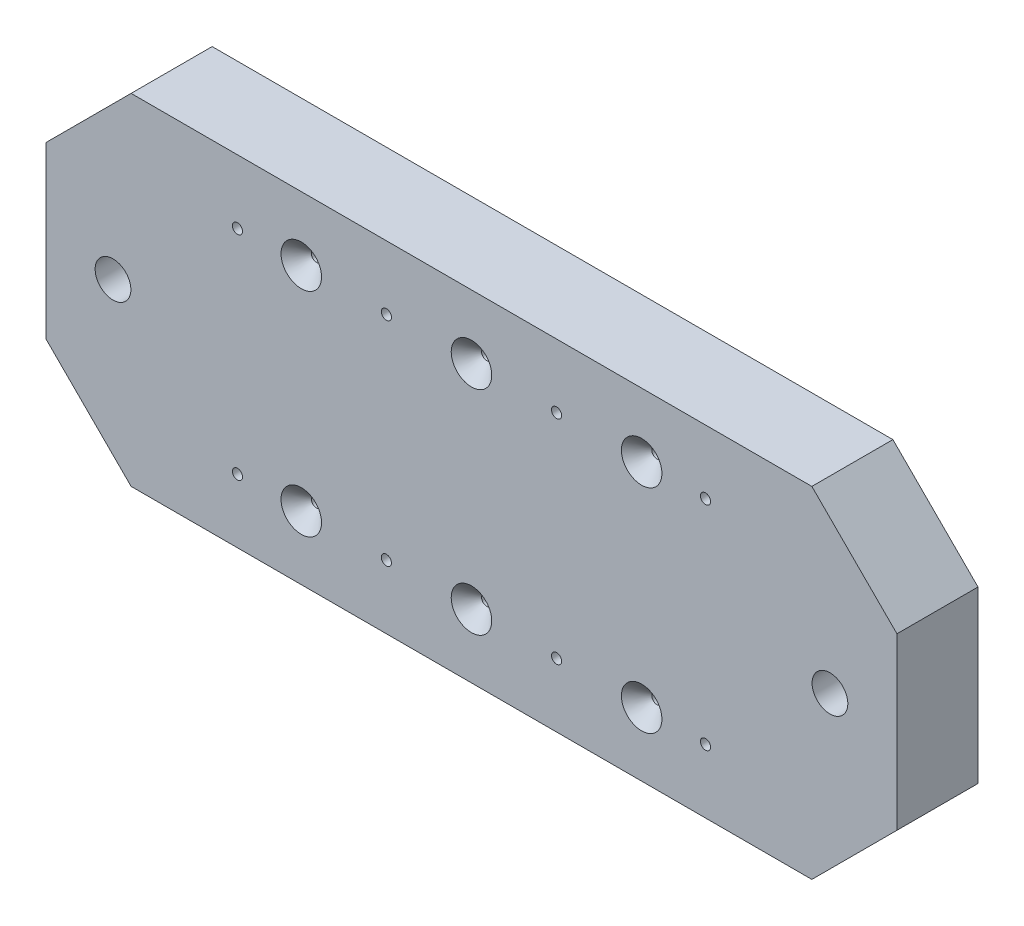
ISO-10303-21;
HEADER;
FILE_DESCRIPTION(('STEP AP214'),'2;1');
FILE_NAME('part.step','',(''),(''),'','','');
FILE_SCHEMA(('AUTOMOTIVE_DESIGN { 1 0 10303 214 1 1 1 1 }'));
ENDSEC;
DATA;
#1=APPLICATION_CONTEXT('core data for automotive mechanical design processes');
#2=APPLICATION_PROTOCOL_DEFINITION('international standard','automotive_design',2000,#1);
#3=PRODUCT_CONTEXT('',#1,'mechanical');
#4=PRODUCT('Part','Part','',(#3));
#5=PRODUCT_RELATED_PRODUCT_CATEGORY('part','',(#4));
#6=PRODUCT_DEFINITION_FORMATION('','',#4);
#7=PRODUCT_DEFINITION_CONTEXT('part definition',#1,'design');
#8=PRODUCT_DEFINITION('design','',#6,#7);
#9=PRODUCT_DEFINITION_SHAPE('','',#8);
#10=(LENGTH_UNIT() NAMED_UNIT(*) SI_UNIT(.MILLI.,.METRE.));
#11=(NAMED_UNIT(*) PLANE_ANGLE_UNIT() SI_UNIT($,.RADIAN.));
#12=(NAMED_UNIT(*) SI_UNIT($,.STERADIAN.) SOLID_ANGLE_UNIT());
#13=UNCERTAINTY_MEASURE_WITH_UNIT(LENGTH_MEASURE(1.E-05),#10,'distance_accuracy_value','');
#14=(GEOMETRIC_REPRESENTATION_CONTEXT(3) GLOBAL_UNCERTAINTY_ASSIGNED_CONTEXT((#13)) GLOBAL_UNIT_ASSIGNED_CONTEXT((#10,
#11,#12)) REPRESENTATION_CONTEXT('',''));
#15=CARTESIAN_POINT('',(0.,0.,0.));
#16=DIRECTION('',(0.,0.,1.));
#17=DIRECTION('',(1.,0.,0.));
#18=AXIS2_PLACEMENT_3D('',#15,#16,#17);
#19=CARTESIAN_POINT('',(0.,-40.,50.8));
#20=DIRECTION('',(0.,0.,-1.));
#21=DIRECTION('',(0.,-1.,0.));
#22=AXIS2_PLACEMENT_3D('',#19,#20,#21);
#23=PLANE('',#22);
#24=CARTESIAN_POINT('',(40.,24.9999999999985,50.8));
#25=DIRECTION('',(0.,0.,1.));
#26=DIRECTION('',(1.,0.,0.));
#27=AXIS2_PLACEMENT_3D('',#24,#25,#26);
#28=CIRCLE('',#27,1.190625);
#29=CARTESIAN_POINT('',(38.809375,24.9999999999985,50.8));
#30=VERTEX_POINT('',#29);
#31=EDGE_CURVE('E28',#30,#30,#28,.T.);
#32=ORIENTED_EDGE('',*,*,#31,.T.);
#33=EDGE_LOOP('',(#32));
#34=FACE_BOUND('',#33,.T.);
#35=CARTESIAN_POINT('',(0.,24.9999999999985,50.8));
#36=DIRECTION('',(0.,0.,1.));
#37=DIRECTION('',(1.,0.,0.));
#38=AXIS2_PLACEMENT_3D('',#35,#36,#37);
#39=CIRCLE('',#38,1.190625);
#40=CARTESIAN_POINT('',(-1.190625,24.9999999999985,50.8));
#41=VERTEX_POINT('',#40);
#42=EDGE_CURVE('E349',#41,#41,#39,.T.);
#43=ORIENTED_EDGE('',*,*,#42,.T.);
#44=EDGE_LOOP('',(#43));
#45=FACE_BOUND('',#44,.T.);
#46=CARTESIAN_POINT('',(-40.,24.9999999999985,50.8));
#47=DIRECTION('',(0.,0.,1.));
#48=DIRECTION('',(1.,0.,0.));
#49=AXIS2_PLACEMENT_3D('',#46,#47,#48);
#50=CIRCLE('',#49,1.190625);
#51=CARTESIAN_POINT('',(-41.190625,24.9999999999985,50.8));
#52=VERTEX_POINT('',#51);
#53=EDGE_CURVE('E344',#52,#52,#50,.T.);
#54=ORIENTED_EDGE('',*,*,#53,.T.);
#55=EDGE_LOOP('',(#54));
#56=FACE_BOUND('',#55,.T.);
#57=CARTESIAN_POINT('',(-40.,-24.9999999999981,50.8));
#58=DIRECTION('',(0.,0.,1.));
#59=DIRECTION('',(1.,0.,0.));
#60=AXIS2_PLACEMENT_3D('',#57,#58,#59);
#61=CIRCLE('',#60,1.190625);
#62=CARTESIAN_POINT('',(-41.190625,-24.9999999999981,50.8));
#63=VERTEX_POINT('',#62);
#64=EDGE_CURVE('E335',#63,#63,#61,.T.);
#65=ORIENTED_EDGE('',*,*,#64,.T.);
#66=EDGE_LOOP('',(#65));
#67=FACE_BOUND('',#66,.T.);
#68=CARTESIAN_POINT('',(0.,-24.9999999999981,50.8));
#69=DIRECTION('',(0.,0.,1.));
#70=DIRECTION('',(1.,0.,0.));
#71=AXIS2_PLACEMENT_3D('',#68,#69,#70);
#72=CIRCLE('',#71,1.190625);
#73=CARTESIAN_POINT('',(-1.190625,-24.9999999999981,50.8));
#74=VERTEX_POINT('',#73);
#75=EDGE_CURVE('E262',#74,#74,#72,.T.);
#76=ORIENTED_EDGE('',*,*,#75,.T.);
#77=EDGE_LOOP('',(#76));
#78=FACE_BOUND('',#77,.T.);
#79=CARTESIAN_POINT('',(40.,-24.9999999999981,50.8));
#80=DIRECTION('',(0.,0.,1.));
#81=DIRECTION('',(1.,0.,0.));
#82=AXIS2_PLACEMENT_3D('',#79,#80,#81);
#83=CIRCLE('',#82,1.190625);
#84=CARTESIAN_POINT('',(38.809375,-24.9999999999981,50.8));
#85=VERTEX_POINT('',#84);
#86=EDGE_CURVE('E374',#85,#85,#83,.T.);
#87=ORIENTED_EDGE('',*,*,#86,.T.);
#88=EDGE_LOOP('',(#87));
#89=FACE_BOUND('',#88,.T.);
#90=CARTESIAN_POINT('',(55.,-24.9999999999984,50.8));
#91=DIRECTION('',(0.,0.,1.));
#92=DIRECTION('',(-1.,0.,0.));
#93=AXIS2_PLACEMENT_3D('',#90,#91,#92);
#94=CIRCLE('',#93,1.1905);
#95=CARTESIAN_POINT('',(56.1905,-24.9999999999984,50.8));
#96=VERTEX_POINT('',#95);
#97=EDGE_CURVE('E257',#96,#96,#94,.T.);
#98=ORIENTED_EDGE('',*,*,#97,.T.);
#99=EDGE_LOOP('',(#98));
#100=FACE_BOUND('',#99,.T.);
#101=CARTESIAN_POINT('',(20.0000000000074,24.9999999999983,50.8));
#102=DIRECTION('',(0.,0.,1.));
#103=DIRECTION('',(-1.,0.,0.));
#104=AXIS2_PLACEMENT_3D('',#101,#102,#103);
#105=CIRCLE('',#104,1.1905);
#106=CARTESIAN_POINT('',(21.1905000000074,24.9999999999983,50.8));
#107=VERTEX_POINT('',#106);
#108=EDGE_CURVE('E439',#107,#107,#105,.T.);
#109=ORIENTED_EDGE('',*,*,#108,.T.);
#110=EDGE_LOOP('',(#109));
#111=FACE_BOUND('',#110,.T.);
#112=CARTESIAN_POINT('',(-20.0000000000074,-24.9999999999984,50.8));
#113=DIRECTION('',(0.,0.,1.));
#114=DIRECTION('',(-1.,0.,0.));
#115=AXIS2_PLACEMENT_3D('',#112,#113,#114);
#116=CIRCLE('',#115,1.1905);
#117=CARTESIAN_POINT('',(-18.8095000000074,-24.9999999999984,50.8));
#118=VERTEX_POINT('',#117);
#119=EDGE_CURVE('E305',#118,#118,#116,.T.);
#120=ORIENTED_EDGE('',*,*,#119,.T.);
#121=EDGE_LOOP('',(#120));
#122=FACE_BOUND('',#121,.T.);
#123=CARTESIAN_POINT('',(-55.,24.9999999999983,50.8));
#124=DIRECTION('',(0.,0.,1.));
#125=DIRECTION('',(-1.,0.,0.));
#126=AXIS2_PLACEMENT_3D('',#123,#124,#125);
#127=CIRCLE('',#126,1.1905);
#128=CARTESIAN_POINT('',(-53.8095,24.9999999999983,50.8));
#129=VERTEX_POINT('',#128);
#130=EDGE_CURVE('E388',#129,#129,#127,.T.);
#131=ORIENTED_EDGE('',*,*,#130,.T.);
#132=EDGE_LOOP('',(#131));
#133=FACE_BOUND('',#132,.T.);
#134=CARTESIAN_POINT('',(-55.,-24.9999999999984,50.8));
#135=DIRECTION('',(0.,0.,1.));
#136=DIRECTION('',(-1.,0.,0.));
#137=AXIS2_PLACEMENT_3D('',#134,#135,#136);
#138=CIRCLE('',#137,1.1905);
#139=CARTESIAN_POINT('',(-53.8095,-24.9999999999984,50.8));
#140=VERTEX_POINT('',#139);
#141=EDGE_CURVE('E320',#140,#140,#138,.T.);
#142=ORIENTED_EDGE('',*,*,#141,.T.);
#143=EDGE_LOOP('',(#142));
#144=FACE_BOUND('',#143,.T.);
#145=CARTESIAN_POINT('',(-20.0000000000074,24.9999999999983,50.8));
#146=DIRECTION('',(0.,0.,1.));
#147=DIRECTION('',(-1.,0.,0.));
#148=AXIS2_PLACEMENT_3D('',#145,#146,#147);
#149=CIRCLE('',#148,1.1905);
#150=CARTESIAN_POINT('',(-18.8095000000074,24.9999999999983,50.8));
#151=VERTEX_POINT('',#150);
#152=EDGE_CURVE('E285',#151,#151,#149,.T.);
#153=ORIENTED_EDGE('',*,*,#152,.T.);
#154=EDGE_LOOP('',(#153));
#155=FACE_BOUND('',#154,.T.);
#156=CARTESIAN_POINT('',(20.0000000000074,-24.9999999999984,50.8));
#157=DIRECTION('',(0.,0.,1.));
#158=DIRECTION('',(-1.,0.,0.));
#159=AXIS2_PLACEMENT_3D('',#156,#157,#158);
#160=CIRCLE('',#159,1.1905);
#161=CARTESIAN_POINT('',(21.1905000000074,-24.9999999999984,50.8));
#162=VERTEX_POINT('',#161);
#163=EDGE_CURVE('E286',#162,#162,#160,.T.);
#164=ORIENTED_EDGE('',*,*,#163,.T.);
#165=EDGE_LOOP('',(#164));
#166=FACE_BOUND('',#165,.T.);
#167=CARTESIAN_POINT('',(55.,24.9999999999983,50.8));
#168=DIRECTION('',(0.,0.,1.));
#169=DIRECTION('',(-1.,0.,0.));
#170=AXIS2_PLACEMENT_3D('',#167,#168,#169);
#171=CIRCLE('',#170,1.1905);
#172=CARTESIAN_POINT('',(56.1905,24.9999999999983,50.8));
#173=VERTEX_POINT('',#172);
#174=EDGE_CURVE('E266',#173,#173,#171,.T.);
#175=ORIENTED_EDGE('',*,*,#174,.T.);
#176=EDGE_LOOP('',(#175));
#177=FACE_BOUND('',#176,.T.);
#178=CARTESIAN_POINT('',(84.25,1.64217580027154E-13,50.8));
#179=DIRECTION('',(0.,0.,1.));
#180=DIRECTION('',(1.,0.,0.));
#181=AXIS2_PLACEMENT_3D('',#178,#179,#180);
#182=CIRCLE('',#181,4.19999999999989);
#183=CARTESIAN_POINT('',(80.05,1.63703228371513E-13,50.8));
#184=VERTEX_POINT('',#183);
#185=EDGE_CURVE('E264',#184,#184,#182,.T.);
#186=ORIENTED_EDGE('',*,*,#185,.T.);
#187=EDGE_LOOP('',(#186));
#188=FACE_BOUND('',#187,.T.);
#189=CARTESIAN_POINT('',(-84.25,1.6435571165336E-13,50.8));
#190=DIRECTION('',(0.,0.,1.));
#191=DIRECTION('',(1.,0.,0.));
#192=AXIS2_PLACEMENT_3D('',#189,#190,#191);
#193=CIRCLE('',#192,4.19999999999989);
#194=CARTESIAN_POINT('',(-88.45,1.63841359997718E-13,50.8));
#195=VERTEX_POINT('',#194);
#196=EDGE_CURVE('E424',#195,#195,#193,.T.);
#197=ORIENTED_EDGE('',*,*,#196,.T.);
#198=EDGE_LOOP('',(#197));
#199=FACE_BOUND('',#198,.T.);
#200=DIRECTION('',(-0.707106781186547,0.707106781186548,0.));
#201=VECTOR('',#200,1.);
#202=CARTESIAN_POINT('',(85.,35.,50.8));
#203=LINE('',#202,#201);
#204=CARTESIAN_POINT('',(100.,20.,50.8));
#205=VERTEX_POINT('',#204);
#206=CARTESIAN_POINT('',(80.,40.,50.8));
#207=VERTEX_POINT('',#206);
#208=EDGE_CURVE('E241',#205,#207,#203,.T.);
#209=ORIENTED_EDGE('',*,*,#208,.F.);
#210=DIRECTION('',(0.,-1.,0.));
#211=VECTOR('',#210,1.);
#212=CARTESIAN_POINT('',(100.,-20.,50.8));
#213=LINE('',#212,#211);
#214=CARTESIAN_POINT('',(100.,-20.,50.8));
#215=VERTEX_POINT('',#214);
#216=EDGE_CURVE('E225',#205,#215,#213,.T.);
#217=ORIENTED_EDGE('',*,*,#216,.T.);
#218=DIRECTION('',(0.707106781186548,0.707106781186548,0.));
#219=VECTOR('',#218,1.);
#220=CARTESIAN_POINT('',(65.,-55.,50.8));
#221=LINE('',#220,#219);
#222=CARTESIAN_POINT('',(80.,-40.,50.8));
#223=VERTEX_POINT('',#222);
#224=EDGE_CURVE('E293',#223,#215,#221,.T.);
#225=ORIENTED_EDGE('',*,*,#224,.F.);
#226=DIRECTION('',(1.,0.,0.));
#227=VECTOR('',#226,1.);
#228=CARTESIAN_POINT('',(0.,-40.,50.8));
#229=LINE('',#228,#227);
#230=CARTESIAN_POINT('',(-80.,-40.,50.8));
#231=VERTEX_POINT('',#230);
#232=EDGE_CURVE('E292',#231,#223,#229,.T.);
#233=ORIENTED_EDGE('',*,*,#232,.F.);
#234=DIRECTION('',(0.707106781186548,-0.707106781186548,0.));
#235=VECTOR('',#234,1.);
#236=CARTESIAN_POINT('',(-65.,-55.,50.8));
#237=LINE('',#236,#235);
#238=CARTESIAN_POINT('',(-100.,-20.,50.8));
#239=VERTEX_POINT('',#238);
#240=EDGE_CURVE('E373',#239,#231,#237,.T.);
#241=ORIENTED_EDGE('',*,*,#240,.F.);
#242=DIRECTION('',(0.,1.,0.));
#243=VECTOR('',#242,1.);
#244=CARTESIAN_POINT('',(-100.,20.,50.8));
#245=LINE('',#244,#243);
#246=CARTESIAN_POINT('',(-100.,20.,50.8));
#247=VERTEX_POINT('',#246);
#248=EDGE_CURVE('E329',#239,#247,#245,.T.);
#249=ORIENTED_EDGE('',*,*,#248,.T.);
#250=DIRECTION('',(-0.707106781186547,-0.707106781186548,0.));
#251=VECTOR('',#250,1.);
#252=CARTESIAN_POINT('',(-85.,35.,50.8));
#253=LINE('',#252,#251);
#254=CARTESIAN_POINT('',(-80.,40.,50.8));
#255=VERTEX_POINT('',#254);
#256=EDGE_CURVE('E328',#255,#247,#253,.T.);
#257=ORIENTED_EDGE('',*,*,#256,.F.);
#258=DIRECTION('',(1.,0.,0.));
#259=VECTOR('',#258,1.);
#260=CARTESIAN_POINT('',(0.,40.,50.8));
#261=LINE('',#260,#259);
#262=EDGE_CURVE('E11',#255,#207,#261,.T.);
#263=ORIENTED_EDGE('',*,*,#262,.T.);
#264=EDGE_LOOP('',(#209,#217,#225,#233,#241,#249,#257,#263));
#265=FACE_BOUND('',#264,.T.);
#266=ADVANCED_FACE('F17',(#34,#45,#56,#67,#78,#89,#100,#111,#122,#133,#144,#155,#166,#177,#188,
#199,#265),#23,.T.);
#267=CARTESIAN_POINT('',(0.,40.,50.8));
#268=DIRECTION('',(0.,1.,0.));
#269=DIRECTION('',(0.,0.,-1.));
#270=AXIS2_PLACEMENT_3D('',#267,#268,#269);
#271=PLANE('',#270);
#272=DIRECTION('',(0.,0.,1.));
#273=VECTOR('',#272,1.);
#274=CARTESIAN_POINT('',(80.,40.,55.5625));
#275=LINE('',#274,#273);
#276=CARTESIAN_POINT('',(80.,40.,69.85));
#277=VERTEX_POINT('',#276);
#278=EDGE_CURVE('E216',#207,#277,#275,.T.);
#279=ORIENTED_EDGE('',*,*,#278,.F.);
#280=ORIENTED_EDGE('',*,*,#262,.F.);
#281=DIRECTION('',(0.,0.,-1.));
#282=VECTOR('',#281,1.);
#283=CARTESIAN_POINT('',(-80.,40.,55.5625));
#284=LINE('',#283,#282);
#285=CARTESIAN_POINT('',(-80.,40.,69.85));
#286=VERTEX_POINT('',#285);
#287=EDGE_CURVE('E219',#286,#255,#284,.T.);
#288=ORIENTED_EDGE('',*,*,#287,.F.);
#289=DIRECTION('',(1.,0.,0.));
#290=VECTOR('',#289,1.);
#291=CARTESIAN_POINT('',(0.,40.,69.85));
#292=LINE('',#291,#290);
#293=EDGE_CURVE('E212',#286,#277,#292,.T.);
#294=ORIENTED_EDGE('',*,*,#293,.T.);
#295=EDGE_LOOP('',(#279,#280,#288,#294));
#296=FACE_BOUND('',#295,.T.);
#297=ADVANCED_FACE('F214',(#296),#271,.T.);
#298=CARTESIAN_POINT('',(40.,24.9999999999984,31.4325));
#299=DIRECTION('',(0.,0.,-1.));
#300=DIRECTION('',(1.,0.,0.));
#301=AXIS2_PLACEMENT_3D('',#298,#299,#300);
#302=CYLINDRICAL_SURFACE('',#301,1.190625);
#303=CARTESIAN_POINT('',(40.,24.9999999999985,66.2781249999999));
#304=DIRECTION('',(0.,0.,-1.));
#305=DIRECTION('',(1.,0.,0.));
#306=AXIS2_PLACEMENT_3D('',#303,#304,#305);
#307=CIRCLE('',#306,1.190625);
#308=CARTESIAN_POINT('',(38.809375,24.9999999999986,66.2781249999999));
#309=VERTEX_POINT('',#308);
#310=EDGE_CURVE('E251',#309,#309,#307,.T.);
#311=ORIENTED_EDGE('',*,*,#310,.F.);
#312=DIRECTION('',(0.,0.,-1.));
#313=VECTOR('',#312,1.);
#314=CARTESIAN_POINT('',(38.809375,24.9999999999984,31.4325));
#315=LINE('',#314,#313);
#316=EDGE_CURVE('E448',#309,#30,#315,.T.);
#317=ORIENTED_EDGE('',*,*,#316,.T.);
#318=ORIENTED_EDGE('',*,*,#31,.F.);
#319=ORIENTED_EDGE('',*,*,#316,.F.);
#320=EDGE_LOOP('',(#311,#317,#318,#319));
#321=FACE_BOUND('',#320,.T.);
#322=ADVANCED_FACE('F814',(#321),#302,.F.);
#323=CARTESIAN_POINT('',(40.,24.9999999999986,68.0640624999999));
#324=DIRECTION('',(0.,0.,1.));
#325=DIRECTION('',(1.,0.,0.));
#326=AXIS2_PLACEMENT_3D('',#323,#324,#325);
#327=CONICAL_SURFACE('',#326,2.9765625,0.785398163397448);
#328=CARTESIAN_POINT('',(40.,24.9999999999986,69.85));
#329=DIRECTION('',(0.,0.,-1.));
#330=DIRECTION('',(1.,0.,0.));
#331=AXIS2_PLACEMENT_3D('',#328,#329,#330);
#332=CIRCLE('',#331,4.7625);
#333=CARTESIAN_POINT('',(35.2375,24.9999999999986,69.85));
#334=VERTEX_POINT('',#333);
#335=EDGE_CURVE('E304',#334,#334,#332,.T.);
#336=ORIENTED_EDGE('',*,*,#335,.F.);
#337=DIRECTION('',(0.707106781186548,0.,-0.707106781186548));
#338=VECTOR('',#337,1.);
#339=CARTESIAN_POINT('',(37.0234375,24.9999999999986,68.0640624999999));
#340=LINE('',#339,#338);
#341=EDGE_CURVE('E364',#334,#309,#340,.T.);
#342=ORIENTED_EDGE('',*,*,#341,.T.);
#343=ORIENTED_EDGE('',*,*,#310,.T.);
#344=ORIENTED_EDGE('',*,*,#341,.F.);
#345=EDGE_LOOP('',(#336,#342,#343,#344));
#346=FACE_BOUND('',#345,.T.);
#347=ADVANCED_FACE('F819',(#346),#327,.F.);
#348=CARTESIAN_POINT('',(0.,24.9999999999984,31.4325));
#349=DIRECTION('',(0.,0.,-1.));
#350=DIRECTION('',(1.,0.,0.));
#351=AXIS2_PLACEMENT_3D('',#348,#349,#350);
#352=CYLINDRICAL_SURFACE('',#351,1.190625);
#353=CARTESIAN_POINT('',(0.,24.9999999999985,66.2781249999999));
#354=DIRECTION('',(0.,0.,-1.));
#355=DIRECTION('',(1.,0.,0.));
#356=AXIS2_PLACEMENT_3D('',#353,#354,#355);
#357=CIRCLE('',#356,1.190625);
#358=CARTESIAN_POINT('',(-1.190625,24.9999999999985,66.2781249999999));
#359=VERTEX_POINT('',#358);
#360=EDGE_CURVE('E350',#359,#359,#357,.T.);
#361=ORIENTED_EDGE('',*,*,#360,.F.);
#362=DIRECTION('',(0.,0.,-1.));
#363=VECTOR('',#362,1.);
#364=CARTESIAN_POINT('',(-1.190625,24.9999999999984,31.4325));
#365=LINE('',#364,#363);
#366=EDGE_CURVE('E345',#359,#41,#365,.T.);
#367=ORIENTED_EDGE('',*,*,#366,.T.);
#368=ORIENTED_EDGE('',*,*,#42,.F.);
#369=ORIENTED_EDGE('',*,*,#366,.F.);
#370=EDGE_LOOP('',(#361,#367,#368,#369));
#371=FACE_BOUND('',#370,.T.);
#372=ADVANCED_FACE('F899',(#371),#352,.F.);
#373=CARTESIAN_POINT('',(0.,24.9999999999985,68.0640624999999));
#374=DIRECTION('',(0.,0.,1.));
#375=DIRECTION('',(1.,0.,0.));
#376=AXIS2_PLACEMENT_3D('',#373,#374,#375);
#377=CONICAL_SURFACE('',#376,2.9765625,0.785398163397448);
#378=CARTESIAN_POINT('',(0.,24.9999999999985,69.85));
#379=DIRECTION('',(0.,0.,-1.));
#380=DIRECTION('',(1.,0.,0.));
#381=AXIS2_PLACEMENT_3D('',#378,#379,#380);
#382=CIRCLE('',#381,4.7625);
#383=CARTESIAN_POINT('',(-4.7625,24.9999999999985,69.85));
#384=VERTEX_POINT('',#383);
#385=EDGE_CURVE('E395',#384,#384,#382,.T.);
#386=ORIENTED_EDGE('',*,*,#385,.F.);
#387=DIRECTION('',(0.707106781186548,0.,-0.707106781186548));
#388=VECTOR('',#387,1.);
#389=CARTESIAN_POINT('',(-2.97656250000001,24.9999999999985,68.0640624999999));
#390=LINE('',#389,#388);
#391=EDGE_CURVE('E413',#384,#359,#390,.T.);
#392=ORIENTED_EDGE('',*,*,#391,.T.);
#393=ORIENTED_EDGE('',*,*,#360,.T.);
#394=ORIENTED_EDGE('',*,*,#391,.F.);
#395=EDGE_LOOP('',(#386,#392,#393,#394));
#396=FACE_BOUND('',#395,.T.);
#397=ADVANCED_FACE('F19',(#396),#377,.F.);
#398=CARTESIAN_POINT('',(-40.,24.9999999999984,31.4325));
#399=DIRECTION('',(0.,0.,-1.));
#400=DIRECTION('',(1.,0.,0.));
#401=AXIS2_PLACEMENT_3D('',#398,#399,#400);
#402=CYLINDRICAL_SURFACE('',#401,1.190625);
#403=CARTESIAN_POINT('',(-40.,24.9999999999985,66.2781249999999));
#404=DIRECTION('',(0.,0.,-1.));
#405=DIRECTION('',(1.,0.,0.));
#406=AXIS2_PLACEMENT_3D('',#403,#404,#405);
#407=CIRCLE('',#406,1.190625);
#408=CARTESIAN_POINT('',(-41.190625,24.9999999999985,66.2781249999999));
#409=VERTEX_POINT('',#408);
#410=EDGE_CURVE('E334',#409,#409,#407,.T.);
#411=ORIENTED_EDGE('',*,*,#410,.F.);
#412=DIRECTION('',(0.,0.,-1.));
#413=VECTOR('',#412,1.);
#414=CARTESIAN_POINT('',(-41.190625,24.9999999999984,31.4325));
#415=LINE('',#414,#413);
#416=EDGE_CURVE('E340',#409,#52,#415,.T.);
#417=ORIENTED_EDGE('',*,*,#416,.T.);
#418=ORIENTED_EDGE('',*,*,#53,.F.);
#419=ORIENTED_EDGE('',*,*,#416,.F.);
#420=EDGE_LOOP('',(#411,#417,#418,#419));
#421=FACE_BOUND('',#420,.T.);
#422=ADVANCED_FACE('F850',(#421),#402,.F.);
#423=CARTESIAN_POINT('',(-40.,24.9999999999985,68.0640624999999));
#424=DIRECTION('',(0.,0.,1.));
#425=DIRECTION('',(1.,0.,0.));
#426=AXIS2_PLACEMENT_3D('',#423,#424,#425);
#427=CONICAL_SURFACE('',#426,2.9765625,0.785398163397448);
#428=CARTESIAN_POINT('',(-40.,24.9999999999985,69.85));
#429=DIRECTION('',(0.,0.,-1.));
#430=DIRECTION('',(1.,0.,0.));
#431=AXIS2_PLACEMENT_3D('',#428,#429,#430);
#432=CIRCLE('',#431,4.7625);
#433=CARTESIAN_POINT('',(-44.7625,24.9999999999985,69.85));
#434=VERTEX_POINT('',#433);
#435=EDGE_CURVE('E399',#434,#434,#432,.T.);
#436=ORIENTED_EDGE('',*,*,#435,.F.);
#437=DIRECTION('',(0.707106781186548,0.,-0.707106781186548));
#438=VECTOR('',#437,1.);
#439=CARTESIAN_POINT('',(-42.9765625,24.9999999999985,68.0640624999999));
#440=LINE('',#439,#438);
#441=EDGE_CURVE('E330',#434,#409,#440,.T.);
#442=ORIENTED_EDGE('',*,*,#441,.T.);
#443=ORIENTED_EDGE('',*,*,#410,.T.);
#444=ORIENTED_EDGE('',*,*,#441,.F.);
#445=EDGE_LOOP('',(#436,#442,#443,#444));
#446=FACE_BOUND('',#445,.T.);
#447=ADVANCED_FACE('F775',(#446),#427,.F.);
#448=CARTESIAN_POINT('',(-40.,-24.9999999999982,31.4325));
#449=DIRECTION('',(0.,0.,-1.));
#450=DIRECTION('',(1.,0.,0.));
#451=AXIS2_PLACEMENT_3D('',#448,#449,#450);
#452=CYLINDRICAL_SURFACE('',#451,1.190625);
#453=CARTESIAN_POINT('',(-40.,-24.9999999999981,66.278125));
#454=DIRECTION('',(0.,0.,-1.));
#455=DIRECTION('',(1.,0.,0.));
#456=AXIS2_PLACEMENT_3D('',#453,#454,#455);
#457=CIRCLE('',#456,1.190625);
#458=CARTESIAN_POINT('',(-41.190625,-24.9999999999981,66.278125));
#459=VERTEX_POINT('',#458);
#460=EDGE_CURVE('E475',#459,#459,#457,.T.);
#461=ORIENTED_EDGE('',*,*,#460,.F.);
#462=DIRECTION('',(0.,0.,-1.));
#463=VECTOR('',#462,1.);
#464=CARTESIAN_POINT('',(-41.190625,-24.9999999999982,31.4325));
#465=LINE('',#464,#463);
#466=EDGE_CURVE('E393',#459,#63,#465,.T.);
#467=ORIENTED_EDGE('',*,*,#466,.T.);
#468=ORIENTED_EDGE('',*,*,#64,.F.);
#469=ORIENTED_EDGE('',*,*,#466,.F.);
#470=EDGE_LOOP('',(#461,#467,#468,#469));
#471=FACE_BOUND('',#470,.T.);
#472=ADVANCED_FACE('F550',(#471),#452,.F.);
#473=CARTESIAN_POINT('',(-40.,-24.9999999999981,68.0640625));
#474=DIRECTION('',(0.,0.,1.));
#475=DIRECTION('',(1.,0.,0.));
#476=AXIS2_PLACEMENT_3D('',#473,#474,#475);
#477=CONICAL_SURFACE('',#476,2.9765625,0.785398163397448);
#478=CARTESIAN_POINT('',(-40.,-24.9999999999981,69.85));
#479=DIRECTION('',(0.,0.,-1.));
#480=DIRECTION('',(1.,0.,0.));
#481=AXIS2_PLACEMENT_3D('',#478,#479,#480);
#482=CIRCLE('',#481,4.7625);
#483=CARTESIAN_POINT('',(-44.7625,-24.9999999999981,69.85));
#484=VERTEX_POINT('',#483);
#485=EDGE_CURVE('E298',#484,#484,#482,.T.);
#486=ORIENTED_EDGE('',*,*,#485,.F.);
#487=DIRECTION('',(0.707106781186548,0.,-0.707106781186548));
#488=VECTOR('',#487,1.);
#489=CARTESIAN_POINT('',(-42.9765625,-24.9999999999981,68.0640625));
#490=LINE('',#489,#488);
#491=EDGE_CURVE('E319',#484,#459,#490,.T.);
#492=ORIENTED_EDGE('',*,*,#491,.T.);
#493=ORIENTED_EDGE('',*,*,#460,.T.);
#494=ORIENTED_EDGE('',*,*,#491,.F.);
#495=EDGE_LOOP('',(#486,#492,#493,#494));
#496=FACE_BOUND('',#495,.T.);
#497=ADVANCED_FACE('F547',(#496),#477,.F.);
#498=CARTESIAN_POINT('',(0.,-24.9999999999982,31.4325));
#499=DIRECTION('',(0.,0.,-1.));
#500=DIRECTION('',(1.,0.,0.));
#501=AXIS2_PLACEMENT_3D('',#498,#499,#500);
#502=CYLINDRICAL_SURFACE('',#501,1.190625);
#503=CARTESIAN_POINT('',(0.,-24.9999999999981,66.278125));
#504=DIRECTION('',(0.,0.,-1.));
#505=DIRECTION('',(1.,0.,0.));
#506=AXIS2_PLACEMENT_3D('',#503,#504,#505);
#507=CIRCLE('',#506,1.190625);
#508=CARTESIAN_POINT('',(-1.190625,-24.9999999999981,66.278125));
#509=VERTEX_POINT('',#508);
#510=EDGE_CURVE('E263',#509,#509,#507,.T.);
#511=ORIENTED_EDGE('',*,*,#510,.F.);
#512=DIRECTION('',(0.,0.,-1.));
#513=VECTOR('',#512,1.);
#514=CARTESIAN_POINT('',(-1.190625,-24.9999999999982,31.4325));
#515=LINE('',#514,#513);
#516=EDGE_CURVE('E258',#509,#74,#515,.T.);
#517=ORIENTED_EDGE('',*,*,#516,.T.);
#518=ORIENTED_EDGE('',*,*,#75,.F.);
#519=ORIENTED_EDGE('',*,*,#516,.F.);
#520=EDGE_LOOP('',(#511,#517,#518,#519));
#521=FACE_BOUND('',#520,.T.);
#522=ADVANCED_FACE('F787',(#521),#502,.F.);
#523=CARTESIAN_POINT('',(0.,-24.9999999999981,68.0640625));
#524=DIRECTION('',(0.,0.,1.));
#525=DIRECTION('',(1.,0.,0.));
#526=AXIS2_PLACEMENT_3D('',#523,#524,#525);
#527=CONICAL_SURFACE('',#526,2.9765625,0.785398163397448);
#528=CARTESIAN_POINT('',(0.,-24.9999999999981,69.85));
#529=DIRECTION('',(0.,0.,-1.));
#530=DIRECTION('',(1.,0.,0.));
#531=AXIS2_PLACEMENT_3D('',#528,#529,#530);
#532=CIRCLE('',#531,4.7625);
#533=CARTESIAN_POINT('',(-4.7625,-24.9999999999981,69.85));
#534=VERTEX_POINT('',#533);
#535=EDGE_CURVE('E294',#534,#534,#532,.T.);
#536=ORIENTED_EDGE('',*,*,#535,.F.);
#537=DIRECTION('',(0.707106781186548,0.,-0.707106781186548));
#538=VECTOR('',#537,1.);
#539=CARTESIAN_POINT('',(-2.9765625,-24.9999999999981,68.0640625));
#540=LINE('',#539,#538);
#541=EDGE_CURVE('E378',#534,#509,#540,.T.);
#542=ORIENTED_EDGE('',*,*,#541,.T.);
#543=ORIENTED_EDGE('',*,*,#510,.T.);
#544=ORIENTED_EDGE('',*,*,#541,.F.);
#545=EDGE_LOOP('',(#536,#542,#543,#544));
#546=FACE_BOUND('',#545,.T.);
#547=ADVANCED_FACE('F781',(#546),#527,.F.);
#548=CARTESIAN_POINT('',(40.,-24.9999999999982,31.4325));
#549=DIRECTION('',(0.,0.,-1.));
#550=DIRECTION('',(1.,0.,0.));
#551=AXIS2_PLACEMENT_3D('',#548,#549,#550);
#552=CYLINDRICAL_SURFACE('',#551,1.190625);
#553=CARTESIAN_POINT('',(40.,-24.9999999999981,66.278125));
#554=DIRECTION('',(0.,0.,-1.));
#555=DIRECTION('',(1.,0.,0.));
#556=AXIS2_PLACEMENT_3D('',#553,#554,#555);
#557=CIRCLE('',#556,1.190625);
#558=CARTESIAN_POINT('',(38.809375,-24.9999999999981,66.278125));
#559=VERTEX_POINT('',#558);
#560=EDGE_CURVE('E410',#559,#559,#557,.T.);
#561=ORIENTED_EDGE('',*,*,#560,.F.);
#562=DIRECTION('',(0.,0.,-1.));
#563=VECTOR('',#562,1.);
#564=CARTESIAN_POINT('',(38.809375,-24.9999999999982,31.4325));
#565=LINE('',#564,#563);
#566=EDGE_CURVE('E379',#559,#85,#565,.T.);
#567=ORIENTED_EDGE('',*,*,#566,.T.);
#568=ORIENTED_EDGE('',*,*,#86,.F.);
#569=ORIENTED_EDGE('',*,*,#566,.F.);
#570=EDGE_LOOP('',(#561,#567,#568,#569));
#571=FACE_BOUND('',#570,.T.);
#572=ADVANCED_FACE('F786',(#571),#552,.F.);
#573=CARTESIAN_POINT('',(40.,-24.999999999998,68.0640625));
#574=DIRECTION('',(0.,0.,1.));
#575=DIRECTION('',(1.,0.,0.));
#576=AXIS2_PLACEMENT_3D('',#573,#574,#575);
#577=CONICAL_SURFACE('',#576,2.9765625,0.785398163397448);
#578=CARTESIAN_POINT('',(40.,-24.999999999998,69.85));
#579=DIRECTION('',(0.,0.,-1.));
#580=DIRECTION('',(1.,0.,0.));
#581=AXIS2_PLACEMENT_3D('',#578,#579,#580);
#582=CIRCLE('',#581,4.7625);
#583=CARTESIAN_POINT('',(35.2375,-24.999999999998,69.85));
#584=VERTEX_POINT('',#583);
#585=EDGE_CURVE('E299',#584,#584,#582,.T.);
#586=ORIENTED_EDGE('',*,*,#585,.F.);
#587=DIRECTION('',(0.707106781186548,0.,-0.707106781186548));
#588=VECTOR('',#587,1.);
#589=CARTESIAN_POINT('',(37.0234375,-24.999999999998,68.0640625));
#590=LINE('',#589,#588);
#591=EDGE_CURVE('E256',#584,#559,#590,.T.);
#592=ORIENTED_EDGE('',*,*,#591,.T.);
#593=ORIENTED_EDGE('',*,*,#560,.T.);
#594=ORIENTED_EDGE('',*,*,#591,.F.);
#595=EDGE_LOOP('',(#586,#592,#593,#594));
#596=FACE_BOUND('',#595,.T.);
#597=ADVANCED_FACE('F867',(#596),#577,.F.);
#598=CARTESIAN_POINT('',(55.,-24.9999999999983,38.4175));
#599=DIRECTION('',(0.,0.,1.));
#600=DIRECTION('',(-1.,0.,0.));
#601=AXIS2_PLACEMENT_3D('',#598,#599,#600);
#602=CYLINDRICAL_SURFACE('',#601,1.1905);
#603=ORIENTED_EDGE('',*,*,#97,.F.);
#604=DIRECTION('',(0.,0.,1.));
#605=VECTOR('',#604,1.);
#606=CARTESIAN_POINT('',(56.1905,-24.9999999999983,38.4175));
#607=LINE('',#606,#605);
#608=CARTESIAN_POINT('',(56.1905,-24.9999999999984,69.85));
#609=VERTEX_POINT('',#608);
#610=EDGE_CURVE('E253',#96,#609,#607,.T.);
#611=ORIENTED_EDGE('',*,*,#610,.T.);
#612=CARTESIAN_POINT('',(55.,-24.9999999999984,69.85));
#613=DIRECTION('',(0.,0.,-1.));
#614=DIRECTION('',(-1.,0.,0.));
#615=AXIS2_PLACEMENT_3D('',#612,#613,#614);
#616=CIRCLE('',#615,1.19050000000046);
#617=EDGE_CURVE('E463',#609,#609,#616,.T.);
#618=ORIENTED_EDGE('',*,*,#617,.F.);
#619=ORIENTED_EDGE('',*,*,#610,.F.);
#620=EDGE_LOOP('',(#603,#611,#618,#619));
#621=FACE_BOUND('',#620,.T.);
#622=ADVANCED_FACE('F872',(#621),#602,.F.);
#623=CARTESIAN_POINT('',(20.0000000000074,24.9999999999983,38.4175));
#624=DIRECTION('',(0.,0.,1.));
#625=DIRECTION('',(-1.,0.,0.));
#626=AXIS2_PLACEMENT_3D('',#623,#624,#625);
#627=CYLINDRICAL_SURFACE('',#626,1.1905);
#628=ORIENTED_EDGE('',*,*,#108,.F.);
#629=DIRECTION('',(0.,0.,1.));
#630=VECTOR('',#629,1.);
#631=CARTESIAN_POINT('',(21.1905000000074,24.9999999999983,38.4175));
#632=LINE('',#631,#630);
#633=CARTESIAN_POINT('',(21.1905000000074,24.9999999999982,69.85));
#634=VERTEX_POINT('',#633);
#635=EDGE_CURVE('E363',#107,#634,#632,.T.);
#636=ORIENTED_EDGE('',*,*,#635,.T.);
#637=CARTESIAN_POINT('',(20.0000000000074,24.9999999999982,69.85));
#638=DIRECTION('',(0.,0.,-1.));
#639=DIRECTION('',(-1.,0.,0.));
#640=AXIS2_PLACEMENT_3D('',#637,#638,#639);
#641=CIRCLE('',#640,1.19050000000011);
#642=EDGE_CURVE('E456',#634,#634,#641,.T.);
#643=ORIENTED_EDGE('',*,*,#642,.F.);
#644=ORIENTED_EDGE('',*,*,#635,.F.);
#645=EDGE_LOOP('',(#628,#636,#643,#644));
#646=FACE_BOUND('',#645,.T.);
#647=ADVANCED_FACE('F912',(#646),#627,.F.);
#648=CARTESIAN_POINT('',(-20.0000000000074,-24.9999999999984,38.4175));
#649=DIRECTION('',(0.,0.,1.));
#650=DIRECTION('',(-1.,0.,0.));
#651=AXIS2_PLACEMENT_3D('',#648,#649,#650);
#652=CYLINDRICAL_SURFACE('',#651,1.1905);
#653=ORIENTED_EDGE('',*,*,#119,.F.);
#654=DIRECTION('',(0.,0.,1.));
#655=VECTOR('',#654,1.);
#656=CARTESIAN_POINT('',(-18.8095000000074,-24.9999999999984,38.4175));
#657=LINE('',#656,#655);
#658=CARTESIAN_POINT('',(-18.8095000000074,-24.9999999999984,69.85));
#659=VERTEX_POINT('',#658);
#660=EDGE_CURVE('E309',#118,#659,#657,.T.);
#661=ORIENTED_EDGE('',*,*,#660,.T.);
#662=CARTESIAN_POINT('',(-20.0000000000074,-24.9999999999984,69.85));
#663=DIRECTION('',(0.,0.,-1.));
#664=DIRECTION('',(-1.,0.,0.));
#665=AXIS2_PLACEMENT_3D('',#662,#663,#664);
#666=CIRCLE('',#665,1.19050000000046);
#667=EDGE_CURVE('E452',#659,#659,#666,.T.);
#668=ORIENTED_EDGE('',*,*,#667,.F.);
#669=ORIENTED_EDGE('',*,*,#660,.F.);
#670=EDGE_LOOP('',(#653,#661,#668,#669));
#671=FACE_BOUND('',#670,.T.);
#672=ADVANCED_FACE('F883',(#671),#652,.F.);
#673=CARTESIAN_POINT('',(-55.,24.9999999999983,38.4175));
#674=DIRECTION('',(0.,0.,1.));
#675=DIRECTION('',(-1.,0.,0.));
#676=AXIS2_PLACEMENT_3D('',#673,#674,#675);
#677=CYLINDRICAL_SURFACE('',#676,1.1905);
#678=ORIENTED_EDGE('',*,*,#130,.F.);
#679=DIRECTION('',(0.,0.,1.));
#680=VECTOR('',#679,1.);
#681=CARTESIAN_POINT('',(-53.8095,24.9999999999983,38.4175));
#682=LINE('',#681,#680);
#683=CARTESIAN_POINT('',(-53.8095,24.9999999999982,69.85));
#684=VERTEX_POINT('',#683);
#685=EDGE_CURVE('E310',#129,#684,#682,.T.);
#686=ORIENTED_EDGE('',*,*,#685,.T.);
#687=CARTESIAN_POINT('',(-55.,24.9999999999982,69.85));
#688=DIRECTION('',(0.,0.,-1.));
#689=DIRECTION('',(-1.,0.,0.));
#690=AXIS2_PLACEMENT_3D('',#687,#688,#689);
#691=CIRCLE('',#690,1.19050000000011);
#692=EDGE_CURVE('E279',#684,#684,#691,.T.);
#693=ORIENTED_EDGE('',*,*,#692,.F.);
#694=ORIENTED_EDGE('',*,*,#685,.F.);
#695=EDGE_LOOP('',(#678,#686,#693,#694));
#696=FACE_BOUND('',#695,.T.);
#697=ADVANCED_FACE('F878',(#696),#677,.F.);
#698=CARTESIAN_POINT('',(-55.,-24.9999999999983,38.4175));
#699=DIRECTION('',(0.,0.,1.));
#700=DIRECTION('',(-1.,0.,0.));
#701=AXIS2_PLACEMENT_3D('',#698,#699,#700);
#702=CYLINDRICAL_SURFACE('',#701,1.1905);
#703=ORIENTED_EDGE('',*,*,#141,.F.);
#704=DIRECTION('',(0.,0.,1.));
#705=VECTOR('',#704,1.);
#706=CARTESIAN_POINT('',(-53.8095,-24.9999999999983,38.4175));
#707=LINE('',#706,#705);
#708=CARTESIAN_POINT('',(-53.8095,-24.9999999999984,69.85));
#709=VERTEX_POINT('',#708);
#710=EDGE_CURVE('E324',#140,#709,#707,.T.);
#711=ORIENTED_EDGE('',*,*,#710,.T.);
#712=CARTESIAN_POINT('',(-55.,-24.9999999999984,69.85));
#713=DIRECTION('',(0.,0.,-1.));
#714=DIRECTION('',(-1.,0.,0.));
#715=AXIS2_PLACEMENT_3D('',#712,#713,#714);
#716=CIRCLE('',#715,1.19050000000046);
#717=EDGE_CURVE('E275',#709,#709,#716,.T.);
#718=ORIENTED_EDGE('',*,*,#717,.F.);
#719=ORIENTED_EDGE('',*,*,#710,.F.);
#720=EDGE_LOOP('',(#703,#711,#718,#719));
#721=FACE_BOUND('',#720,.T.);
#722=ADVANCED_FACE('F843',(#721),#702,.F.);
#723=CARTESIAN_POINT('',(-20.0000000000074,24.9999999999983,38.4175));
#724=DIRECTION('',(0.,0.,1.));
#725=DIRECTION('',(-1.,0.,0.));
#726=AXIS2_PLACEMENT_3D('',#723,#724,#725);
#727=CYLINDRICAL_SURFACE('',#726,1.1905);
#728=ORIENTED_EDGE('',*,*,#152,.F.);
#729=DIRECTION('',(0.,0.,1.));
#730=VECTOR('',#729,1.);
#731=CARTESIAN_POINT('',(-18.8095000000074,24.9999999999983,38.4175));
#732=LINE('',#731,#730);
#733=CARTESIAN_POINT('',(-18.8095000000074,24.9999999999982,69.85));
#734=VERTEX_POINT('',#733);
#735=EDGE_CURVE('E325',#151,#734,#732,.T.);
#736=ORIENTED_EDGE('',*,*,#735,.T.);
#737=CARTESIAN_POINT('',(-20.0000000000074,24.9999999999982,69.85));
#738=DIRECTION('',(0.,0.,-1.));
#739=DIRECTION('',(-1.,0.,0.));
#740=AXIS2_PLACEMENT_3D('',#737,#738,#739);
#741=CIRCLE('',#740,1.19050000000011);
#742=EDGE_CURVE('E280',#734,#734,#741,.T.);
#743=ORIENTED_EDGE('',*,*,#742,.F.);
#744=ORIENTED_EDGE('',*,*,#735,.F.);
#745=EDGE_LOOP('',(#728,#736,#743,#744));
#746=FACE_BOUND('',#745,.T.);
#747=ADVANCED_FACE('F837',(#746),#727,.F.);
#748=CARTESIAN_POINT('',(20.0000000000074,-24.9999999999983,38.4175));
#749=DIRECTION('',(0.,0.,1.));
#750=DIRECTION('',(-1.,0.,0.));
#751=AXIS2_PLACEMENT_3D('',#748,#749,#750);
#752=CYLINDRICAL_SURFACE('',#751,1.1905);
#753=ORIENTED_EDGE('',*,*,#163,.F.);
#754=DIRECTION('',(0.,0.,1.));
#755=VECTOR('',#754,1.);
#756=CARTESIAN_POINT('',(21.1905000000074,-24.9999999999983,38.4175));
#757=LINE('',#756,#755);
#758=CARTESIAN_POINT('',(21.1905000000074,-24.9999999999984,69.85));
#759=VERTEX_POINT('',#758);
#760=EDGE_CURVE('E281',#162,#759,#757,.T.);
#761=ORIENTED_EDGE('',*,*,#760,.T.);
#762=CARTESIAN_POINT('',(20.0000000000074,-24.9999999999984,69.85));
#763=DIRECTION('',(0.,0.,-1.));
#764=DIRECTION('',(-1.,0.,0.));
#765=AXIS2_PLACEMENT_3D('',#762,#763,#764);
#766=CIRCLE('',#765,1.19050000000046);
#767=EDGE_CURVE('E339',#759,#759,#766,.T.);
#768=ORIENTED_EDGE('',*,*,#767,.F.);
#769=ORIENTED_EDGE('',*,*,#760,.F.);
#770=EDGE_LOOP('',(#753,#761,#768,#769));
#771=FACE_BOUND('',#770,.T.);
#772=ADVANCED_FACE('F842',(#771),#752,.F.);
#773=CARTESIAN_POINT('',(55.,24.9999999999983,38.4175));
#774=DIRECTION('',(0.,0.,1.));
#775=DIRECTION('',(-1.,0.,0.));
#776=AXIS2_PLACEMENT_3D('',#773,#774,#775);
#777=CYLINDRICAL_SURFACE('',#776,1.1905);
#778=ORIENTED_EDGE('',*,*,#174,.F.);
#779=DIRECTION('',(0.,0.,1.));
#780=VECTOR('',#779,1.);
#781=CARTESIAN_POINT('',(56.1905,24.9999999999983,38.4175));
#782=LINE('',#781,#780);
#783=CARTESIAN_POINT('',(56.1905,24.9999999999982,69.85));
#784=VERTEX_POINT('',#783);
#785=EDGE_CURVE('E420',#173,#784,#782,.T.);
#786=ORIENTED_EDGE('',*,*,#785,.T.);
#787=CARTESIAN_POINT('',(55.,24.9999999999982,69.85));
#788=DIRECTION('',(0.,0.,-1.));
#789=DIRECTION('',(-1.,0.,0.));
#790=AXIS2_PLACEMENT_3D('',#787,#788,#789);
#791=CIRCLE('',#790,1.19050000000011);
#792=EDGE_CURVE('E273',#784,#784,#791,.T.);
#793=ORIENTED_EDGE('',*,*,#792,.F.);
#794=ORIENTED_EDGE('',*,*,#785,.F.);
#795=EDGE_LOOP('',(#778,#786,#793,#794));
#796=FACE_BOUND('',#795,.T.);
#797=ADVANCED_FACE('F800',(#796),#777,.F.);
#798=CARTESIAN_POINT('',(84.25,1.92769740662952E-13,59.3725));
#799=DIRECTION('',(0.,0.,-1.));
#800=DIRECTION('',(1.,0.,0.));
#801=AXIS2_PLACEMENT_3D('',#798,#799,#800);
#802=CYLINDRICAL_SURFACE('',#801,4.2);
#803=CARTESIAN_POINT('',(84.25,2.27666825884482E-13,69.85));
#804=DIRECTION('',(0.,0.,-1.));
#805=DIRECTION('',(1.,0.,0.));
#806=AXIS2_PLACEMENT_3D('',#803,#804,#805);
#807=CIRCLE('',#806,4.2);
#808=CARTESIAN_POINT('',(80.05,2.28181177540124E-13,69.85));
#809=VERTEX_POINT('',#808);
#810=EDGE_CURVE('E269',#809,#809,#807,.T.);
#811=ORIENTED_EDGE('',*,*,#810,.F.);
#812=DIRECTION('',(0.,0.,-1.));
#813=VECTOR('',#812,1.);
#814=CARTESIAN_POINT('',(80.05,1.93284092318594E-13,59.3725));
#815=LINE('',#814,#813);
#816=EDGE_CURVE('E267',#809,#184,#815,.T.);
#817=ORIENTED_EDGE('',*,*,#816,.T.);
#818=ORIENTED_EDGE('',*,*,#185,.F.);
#819=ORIENTED_EDGE('',*,*,#816,.F.);
#820=EDGE_LOOP('',(#811,#817,#818,#819));
#821=FACE_BOUND('',#820,.T.);
#822=ADVANCED_FACE('F794',(#821),#802,.F.);
#823=CARTESIAN_POINT('',(-84.25,1.92907872289158E-13,59.3725));
#824=DIRECTION('',(0.,0.,-1.));
#825=DIRECTION('',(1.,0.,0.));
#826=AXIS2_PLACEMENT_3D('',#823,#824,#825);
#827=CYLINDRICAL_SURFACE('',#826,4.2);
#828=CARTESIAN_POINT('',(-84.25,2.27804957510688E-13,69.85));
#829=DIRECTION('',(0.,0.,-1.));
#830=DIRECTION('',(1.,0.,0.));
#831=AXIS2_PLACEMENT_3D('',#828,#829,#830);
#832=CIRCLE('',#831,4.2);
#833=CARTESIAN_POINT('',(-88.45,2.2831930916633E-13,69.85));
#834=VERTEX_POINT('',#833);
#835=EDGE_CURVE('E274',#834,#834,#832,.T.);
#836=ORIENTED_EDGE('',*,*,#835,.F.);
#837=DIRECTION('',(0.,0.,-1.));
#838=VECTOR('',#837,1.);
#839=CARTESIAN_POINT('',(-88.45,1.934222239448E-13,59.3725));
#840=LINE('',#839,#838);
#841=EDGE_CURVE('E21',#834,#195,#840,.T.);
#842=ORIENTED_EDGE('',*,*,#841,.T.);
#843=ORIENTED_EDGE('',*,*,#196,.F.);
#844=ORIENTED_EDGE('',*,*,#841,.F.);
#845=EDGE_LOOP('',(#836,#842,#843,#844));
#846=FACE_BOUND('',#845,.T.);
#847=ADVANCED_FACE('F799',(#846),#827,.F.);
#848=CARTESIAN_POINT('',(-90.,30.,55.5625));
#849=DIRECTION('',(-0.707106781186548,0.707106781186547,0.));
#850=DIRECTION('',(0.,0.,1.));
#851=AXIS2_PLACEMENT_3D('',#848,#849,#850);
#852=PLANE('',#851);
#853=DIRECTION('',(0.707106781186547,0.707106781186548,0.));
#854=VECTOR('',#853,1.);
#855=CARTESIAN_POINT('',(-65.,55.,69.85));
#856=LINE('',#855,#854);
#857=CARTESIAN_POINT('',(-100.,20.,69.85));
#858=VERTEX_POINT('',#857);
#859=EDGE_CURVE('E224',#858,#286,#856,.T.);
#860=ORIENTED_EDGE('',*,*,#859,.T.);
#861=ORIENTED_EDGE('',*,*,#287,.T.);
#862=ORIENTED_EDGE('',*,*,#256,.T.);
#863=DIRECTION('',(0.,0.,1.));
#864=VECTOR('',#863,1.);
#865=CARTESIAN_POINT('',(-100.,20.,55.5625));
#866=LINE('',#865,#864);
#867=EDGE_CURVE('E403',#247,#858,#866,.T.);
#868=ORIENTED_EDGE('',*,*,#867,.T.);
#869=EDGE_LOOP('',(#860,#861,#862,#868));
#870=FACE_BOUND('',#869,.T.);
#871=ADVANCED_FACE('F586',(#870),#852,.T.);
#872=CARTESIAN_POINT('',(-100.,0.,60.325));
#873=DIRECTION('',(-1.,0.,0.));
#874=DIRECTION('',(0.,0.,1.));
#875=AXIS2_PLACEMENT_3D('',#872,#873,#874);
#876=PLANE('',#875);
#877=DIRECTION('',(0.,0.,-1.));
#878=VECTOR('',#877,1.);
#879=CARTESIAN_POINT('',(-100.,-20.,65.0875));
#880=LINE('',#879,#878);
#881=CARTESIAN_POINT('',(-100.,-20.,69.85));
#882=VERTEX_POINT('',#881);
#883=EDGE_CURVE('E387',#882,#239,#880,.T.);
#884=ORIENTED_EDGE('',*,*,#883,.F.);
#885=DIRECTION('',(0.,-1.,0.));
#886=VECTOR('',#885,1.);
#887=CARTESIAN_POINT('',(-100.,-20.,69.85));
#888=LINE('',#887,#886);
#889=EDGE_CURVE('E316',#858,#882,#888,.T.);
#890=ORIENTED_EDGE('',*,*,#889,.F.);
#891=ORIENTED_EDGE('',*,*,#867,.F.);
#892=ORIENTED_EDGE('',*,*,#248,.F.);
#893=EDGE_LOOP('',(#884,#890,#891,#892));
#894=FACE_BOUND('',#893,.T.);
#895=ADVANCED_FACE('F826',(#894),#876,.T.);
#896=CARTESIAN_POINT('',(-90.,-30.,65.0875));
#897=DIRECTION('',(-0.707106781186548,-0.707106781186548,0.));
#898=DIRECTION('',(-0.707106781186548,0.707106781186548,0.));
#899=AXIS2_PLACEMENT_3D('',#896,#897,#898);
#900=PLANE('',#899);
#901=ORIENTED_EDGE('',*,*,#240,.T.);
#902=DIRECTION('',(0.,0.,1.));
#903=VECTOR('',#902,1.);
#904=CARTESIAN_POINT('',(-80.,-40.,65.0875));
#905=LINE('',#904,#903);
#906=CARTESIAN_POINT('',(-80.,-40.,69.85));
#907=VERTEX_POINT('',#906);
#908=EDGE_CURVE('E289',#231,#907,#905,.T.);
#909=ORIENTED_EDGE('',*,*,#908,.T.);
#910=DIRECTION('',(-0.707106781186548,0.707106781186548,0.));
#911=VECTOR('',#910,1.);
#912=CARTESIAN_POINT('',(-85.,-35.,69.85));
#913=LINE('',#912,#911);
#914=EDGE_CURVE('E311',#907,#882,#913,.T.);
#915=ORIENTED_EDGE('',*,*,#914,.T.);
#916=ORIENTED_EDGE('',*,*,#883,.T.);
#917=EDGE_LOOP('',(#901,#909,#915,#916));
#918=FACE_BOUND('',#917,.T.);
#919=ADVANCED_FACE('F831',(#918),#900,.T.);
#920=CARTESIAN_POINT('',(0.,-40.,69.85));
#921=DIRECTION('',(0.,-1.,0.));
#922=DIRECTION('',(-1.,0.,0.));
#923=AXIS2_PLACEMENT_3D('',#920,#921,#922);
#924=PLANE('',#923);
#925=DIRECTION('',(0.,0.,-1.));
#926=VECTOR('',#925,1.);
#927=CARTESIAN_POINT('',(80.,-40.,65.0875));
#928=LINE('',#927,#926);
#929=CARTESIAN_POINT('',(80.,-40.,69.85));
#930=VERTEX_POINT('',#929);
#931=EDGE_CURVE('E300',#930,#223,#928,.T.);
#932=ORIENTED_EDGE('',*,*,#931,.F.);
#933=DIRECTION('',(1.,0.,0.));
#934=VECTOR('',#933,1.);
#935=CARTESIAN_POINT('',(0.,-40.,69.85));
#936=LINE('',#935,#934);
#937=EDGE_CURVE('E315',#907,#930,#936,.T.);
#938=ORIENTED_EDGE('',*,*,#937,.F.);
#939=ORIENTED_EDGE('',*,*,#908,.F.);
#940=ORIENTED_EDGE('',*,*,#232,.T.);
#941=EDGE_LOOP('',(#932,#938,#939,#940));
#942=FACE_BOUND('',#941,.T.);
#943=ADVANCED_FACE('F921',(#942),#924,.T.);
#944=CARTESIAN_POINT('',(90.,-30.,65.0875));
#945=DIRECTION('',(0.707106781186548,-0.707106781186548,0.));
#946=DIRECTION('',(0.,0.,-1.));
#947=AXIS2_PLACEMENT_3D('',#944,#945,#946);
#948=PLANE('',#947);
#949=DIRECTION('',(-0.707106781186548,-0.707106781186548,0.));
#950=VECTOR('',#949,1.);
#951=CARTESIAN_POINT('',(85.,-35.,69.85));
#952=LINE('',#951,#950);
#953=CARTESIAN_POINT('',(100.,-20.,69.85));
#954=VERTEX_POINT('',#953);
#955=EDGE_CURVE('E354',#954,#930,#952,.T.);
#956=ORIENTED_EDGE('',*,*,#955,.T.);
#957=ORIENTED_EDGE('',*,*,#931,.T.);
#958=ORIENTED_EDGE('',*,*,#224,.T.);
#959=DIRECTION('',(0.,0.,1.));
#960=VECTOR('',#959,1.);
#961=CARTESIAN_POINT('',(100.,-20.,65.0875));
#962=LINE('',#961,#960);
#963=EDGE_CURVE('E370',#215,#954,#962,.T.);
#964=ORIENTED_EDGE('',*,*,#963,.T.);
#965=EDGE_LOOP('',(#956,#957,#958,#964));
#966=FACE_BOUND('',#965,.T.);
#967=ADVANCED_FACE('F926',(#966),#948,.T.);
#968=CARTESIAN_POINT('',(0.,40.,69.85));
#969=DIRECTION('',(0.,0.,1.));
#970=DIRECTION('',(0.,-1.,0.));
#971=AXIS2_PLACEMENT_3D('',#968,#969,#970);
#972=PLANE('',#971);
#973=ORIENTED_EDGE('',*,*,#335,.T.);
#974=EDGE_LOOP('',(#973));
#975=FACE_BOUND('',#974,.T.);
#976=ORIENTED_EDGE('',*,*,#385,.T.);
#977=EDGE_LOOP('',(#976));
#978=FACE_BOUND('',#977,.T.);
#979=ORIENTED_EDGE('',*,*,#435,.T.);
#980=EDGE_LOOP('',(#979));
#981=FACE_BOUND('',#980,.T.);
#982=ORIENTED_EDGE('',*,*,#485,.T.);
#983=EDGE_LOOP('',(#982));
#984=FACE_BOUND('',#983,.T.);
#985=ORIENTED_EDGE('',*,*,#535,.T.);
#986=EDGE_LOOP('',(#985));
#987=FACE_BOUND('',#986,.T.);
#988=ORIENTED_EDGE('',*,*,#585,.T.);
#989=EDGE_LOOP('',(#988));
#990=FACE_BOUND('',#989,.T.);
#991=ORIENTED_EDGE('',*,*,#617,.T.);
#992=EDGE_LOOP('',(#991));
#993=FACE_BOUND('',#992,.T.);
#994=ORIENTED_EDGE('',*,*,#642,.T.);
#995=EDGE_LOOP('',(#994));
#996=FACE_BOUND('',#995,.T.);
#997=ORIENTED_EDGE('',*,*,#667,.T.);
#998=EDGE_LOOP('',(#997));
#999=FACE_BOUND('',#998,.T.);
#1000=ORIENTED_EDGE('',*,*,#692,.T.);
#1001=EDGE_LOOP('',(#1000));
#1002=FACE_BOUND('',#1001,.T.);
#1003=ORIENTED_EDGE('',*,*,#717,.T.);
#1004=EDGE_LOOP('',(#1003));
#1005=FACE_BOUND('',#1004,.T.);
#1006=ORIENTED_EDGE('',*,*,#742,.T.);
#1007=EDGE_LOOP('',(#1006));
#1008=FACE_BOUND('',#1007,.T.);
#1009=ORIENTED_EDGE('',*,*,#767,.T.);
#1010=EDGE_LOOP('',(#1009));
#1011=FACE_BOUND('',#1010,.T.);
#1012=ORIENTED_EDGE('',*,*,#792,.T.);
#1013=EDGE_LOOP('',(#1012));
#1014=FACE_BOUND('',#1013,.T.);
#1015=ORIENTED_EDGE('',*,*,#810,.T.);
#1016=EDGE_LOOP('',(#1015));
#1017=FACE_BOUND('',#1016,.T.);
#1018=ORIENTED_EDGE('',*,*,#835,.T.);
#1019=EDGE_LOOP('',(#1018));
#1020=FACE_BOUND('',#1019,.T.);
#1021=DIRECTION('',(0.707106781186547,-0.707106781186548,0.));
#1022=VECTOR('',#1021,1.);
#1023=CARTESIAN_POINT('',(65.,55.,69.85));
#1024=LINE('',#1023,#1022);
#1025=CARTESIAN_POINT('',(100.,20.,69.85));
#1026=VERTEX_POINT('',#1025);
#1027=EDGE_CURVE('E228',#277,#1026,#1024,.T.);
#1028=ORIENTED_EDGE('',*,*,#1027,.F.);
#1029=ORIENTED_EDGE('',*,*,#293,.F.);
#1030=ORIENTED_EDGE('',*,*,#859,.F.);
#1031=ORIENTED_EDGE('',*,*,#889,.T.);
#1032=ORIENTED_EDGE('',*,*,#914,.F.);
#1033=ORIENTED_EDGE('',*,*,#937,.T.);
#1034=ORIENTED_EDGE('',*,*,#955,.F.);
#1035=DIRECTION('',(0.,1.,0.));
#1036=VECTOR('',#1035,1.);
#1037=CARTESIAN_POINT('',(100.,20.,69.85));
#1038=LINE('',#1037,#1036);
#1039=EDGE_CURVE('E232',#954,#1026,#1038,.T.);
#1040=ORIENTED_EDGE('',*,*,#1039,.T.);
#1041=EDGE_LOOP('',(#1028,#1029,#1030,#1031,#1032,#1033,#1034,#1040));
#1042=FACE_BOUND('',#1041,.T.);
#1043=ADVANCED_FACE('F229',(#975,#978,#981,#984,#987,#990,#993,#996,#999,#1002,#1005,#1008,
#1011,#1014,#1017,#1020,#1042),#972,.T.);
#1044=CARTESIAN_POINT('',(100.,0.,60.325));
#1045=DIRECTION('',(1.,0.,0.));
#1046=DIRECTION('',(0.,1.,0.));
#1047=AXIS2_PLACEMENT_3D('',#1044,#1045,#1046);
#1048=PLANE('',#1047);
#1049=DIRECTION('',(0.,0.,-1.));
#1050=VECTOR('',#1049,1.);
#1051=CARTESIAN_POINT('',(100.,20.,55.5625));
#1052=LINE('',#1051,#1050);
#1053=EDGE_CURVE('E237',#1026,#205,#1052,.T.);
#1054=ORIENTED_EDGE('',*,*,#1053,.F.);
#1055=ORIENTED_EDGE('',*,*,#1039,.F.);
#1056=ORIENTED_EDGE('',*,*,#963,.F.);
#1057=ORIENTED_EDGE('',*,*,#216,.F.);
#1058=EDGE_LOOP('',(#1054,#1055,#1056,#1057));
#1059=FACE_BOUND('',#1058,.T.);
#1060=ADVANCED_FACE('F968',(#1059),#1048,.T.);
#1061=CARTESIAN_POINT('',(90.,30.,55.5625));
#1062=DIRECTION('',(0.707106781186548,0.707106781186547,0.));
#1063=DIRECTION('',(0.,0.,-1.));
#1064=AXIS2_PLACEMENT_3D('',#1061,#1062,#1063);
#1065=PLANE('',#1064);
#1066=ORIENTED_EDGE('',*,*,#208,.T.);
#1067=ORIENTED_EDGE('',*,*,#278,.T.);
#1068=ORIENTED_EDGE('',*,*,#1027,.T.);
#1069=ORIENTED_EDGE('',*,*,#1053,.T.);
#1070=EDGE_LOOP('',(#1066,#1067,#1068,#1069));
#1071=FACE_BOUND('',#1070,.T.);
#1072=ADVANCED_FACE('F239',(#1071),#1065,.T.);
#1073=CLOSED_SHELL('',(#266,#297,#322,#347,#372,#397,#422,#447,#472,#497,#522,#547,#572,#597,
#622,#647,#672,#697,#722,#747,#772,#797,#822,#847,#871,#895,#919,#943,#967,#1043,#1060,#1072));
#1074=MANIFOLD_SOLID_BREP('B1',#1073);
#1075=ADVANCED_BREP_SHAPE_REPRESENTATION('',(#18,#1074),#14);
#1076=SHAPE_DEFINITION_REPRESENTATION(#9,#1075);
ENDSEC;
END-ISO-10303-21;
